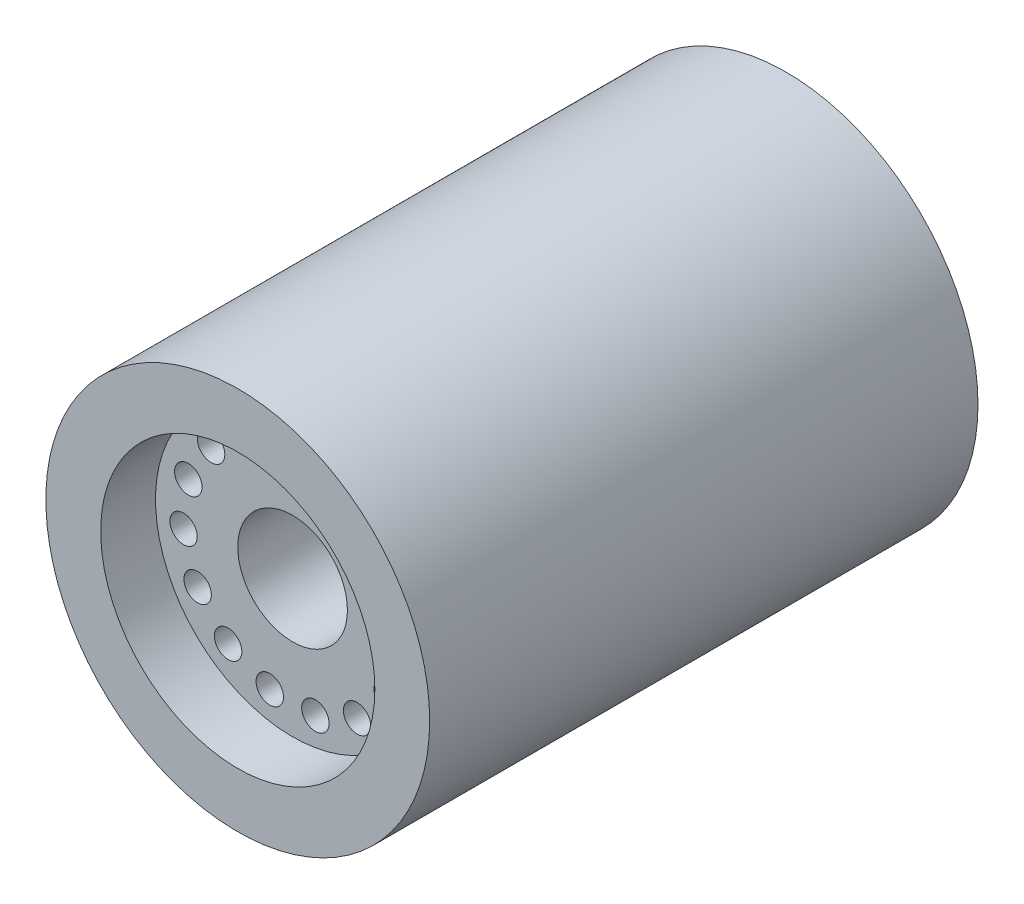
ISO-10303-21;
HEADER;
FILE_DESCRIPTION(('STEP AP214'),'2;1');
FILE_NAME('part.step','',(''),(''),'','','');
FILE_SCHEMA(('AUTOMOTIVE_DESIGN { 1 0 10303 214 1 1 1 1 }'));
ENDSEC;
DATA;
#1=APPLICATION_CONTEXT('core data for automotive mechanical design processes');
#2=APPLICATION_PROTOCOL_DEFINITION('international standard','automotive_design',2000,#1);
#3=PRODUCT_CONTEXT('',#1,'mechanical');
#4=PRODUCT('Part','Part','',(#3));
#5=PRODUCT_RELATED_PRODUCT_CATEGORY('part','',(#4));
#6=PRODUCT_DEFINITION_FORMATION('','',#4);
#7=PRODUCT_DEFINITION_CONTEXT('part definition',#1,'design');
#8=PRODUCT_DEFINITION('design','',#6,#7);
#9=PRODUCT_DEFINITION_SHAPE('','',#8);
#10=(LENGTH_UNIT() NAMED_UNIT(*) SI_UNIT(.MILLI.,.METRE.));
#11=(NAMED_UNIT(*) PLANE_ANGLE_UNIT() SI_UNIT($,.RADIAN.));
#12=(NAMED_UNIT(*) SI_UNIT($,.STERADIAN.) SOLID_ANGLE_UNIT());
#13=UNCERTAINTY_MEASURE_WITH_UNIT(LENGTH_MEASURE(1.E-05),#10,'distance_accuracy_value','');
#14=(GEOMETRIC_REPRESENTATION_CONTEXT(3) GLOBAL_UNCERTAINTY_ASSIGNED_CONTEXT((#13)) GLOBAL_UNIT_ASSIGNED_CONTEXT((#10,
#11,#12)) REPRESENTATION_CONTEXT('',''));
#15=CARTESIAN_POINT('',(0.,0.,0.));
#16=DIRECTION('',(0.,0.,1.));
#17=DIRECTION('',(1.,0.,0.));
#18=AXIS2_PLACEMENT_3D('',#15,#16,#17);
#19=CARTESIAN_POINT('',(0.,0.,100.));
#20=DIRECTION('',(0.,0.,-1.));
#21=DIRECTION('',(-1.,0.,0.));
#22=AXIS2_PLACEMENT_3D('',#19,#20,#21);
#23=CYLINDRICAL_SURFACE('',#22,35.);
#24=CARTESIAN_POINT('',(3.50056930846173,-34.8245030763779,51.6958779282518));
#25=CARTESIAN_POINT('',(3.50056306462018,-34.8245044881549,51.5526963878723));
#26=CARTESIAN_POINT('',(3.48851084502206,-34.82572172866,51.4094158838271));
#27=CARTESIAN_POINT('',(3.44060526173561,-34.8304865382661,51.1268149493158));
#28=CARTESIAN_POINT('',(3.40472453630342,-34.8340367862584,50.9874992635718));
#29=CARTESIAN_POINT('',(3.31019542398208,-34.843146350984,50.7169621478842));
#30=CARTESIAN_POINT('',(3.25155946878842,-34.8487045706025,50.5857363435418));
#31=CARTESIAN_POINT('',(3.11319636067268,-34.8613369101221,50.3350441869105));
#32=CARTESIAN_POINT('',(3.03347388792651,-34.8684106935759,50.2155752332388));
#33=CARTESIAN_POINT('',(2.85501640070205,-34.8834758906714,49.9915164914884));
#34=CARTESIAN_POINT('',(2.75624802699985,-34.8914689042977,49.8869533785149));
#35=CARTESIAN_POINT('',(2.54255998188531,-34.9076903578431,49.6959032479033));
#36=CARTESIAN_POINT('',(2.42763962242006,-34.9159188077795,49.6094170007059));
#37=CARTESIAN_POINT('',(2.18474307928868,-34.9319582235311,49.4568899465369));
#38=CARTESIAN_POINT('',(2.05675265826866,-34.9397687196469,49.3908717583765));
#39=CARTESIAN_POINT('',(1.79143847479645,-34.9543757061059,49.2812995649395));
#40=CARTESIAN_POINT('',(1.65411484175529,-34.9611722105046,49.2377452482587));
#41=CARTESIAN_POINT('',(1.37428680416693,-34.9732884192269,49.1744126639521));
#42=CARTESIAN_POINT('',(1.23179214232253,-34.9786107527021,49.1545918554968));
#43=CARTESIAN_POINT('',(0.945445229572748,-34.9875213215138,49.1391574896014));
#44=CARTESIAN_POINT('',(0.801592998631433,-34.9911095823108,49.143543576733));
#45=CARTESIAN_POINT('',(0.516903366842243,-34.9964719402864,49.1763635529131));
#46=CARTESIAN_POINT('',(0.376060752455348,-34.9982494748281,49.2047516897831));
#47=CARTESIAN_POINT('',(0.101101743042028,-35.000124191676,49.2846988644212));
#48=CARTESIAN_POINT('',(-0.0330146008164454,-35.0002213612011,49.3362580784262));
#49=CARTESIAN_POINT('',(-0.290852266639738,-34.9990294226744,49.4611352600484));
#50=CARTESIAN_POINT('',(-0.414563594066219,-34.9977389978019,49.5344738483442));
#51=CARTESIAN_POINT('',(-0.64795946053717,-34.9941965717247,49.7008129818558));
#52=CARTESIAN_POINT('',(-0.757643782712622,-34.9919445556555,49.7938138310074));
#53=CARTESIAN_POINT('',(-0.960127693048924,-34.9869755655215,49.9970956834442));
#54=CARTESIAN_POINT('',(-1.05288737128987,-34.9842575210355,50.1074164184717));
#55=CARTESIAN_POINT('',(-1.21856855023095,-34.9788791154567,50.3420675879929));
#56=CARTESIAN_POINT('',(-1.29149003957987,-34.976218754397,50.4663980305026));
#57=CARTESIAN_POINT('',(-1.4154119695259,-34.9714236756126,50.725565946093));
#58=CARTESIAN_POINT('',(-1.46641054518352,-34.9692890026139,50.8604043119101));
#59=CARTESIAN_POINT('',(-1.54500234675957,-34.9659052305147,51.1367480690707));
#60=CARTESIAN_POINT('',(-1.57259594844772,-34.9646561171965,51.2782533533377));
#61=CARTESIAN_POINT('',(-1.60353971750706,-34.9632507741844,51.5635653693177));
#62=CARTESIAN_POINT('',(-1.60694555337319,-34.9630920350061,51.7073660524579));
#63=CARTESIAN_POINT('',(-1.5895621581875,-34.9638865818685,51.9934933931417));
#64=CARTESIAN_POINT('',(-1.56877309933111,-34.9648398599948,52.1358200611686));
#65=CARTESIAN_POINT('',(-1.50363984676803,-34.9677010541995,52.4148009627691));
#66=CARTESIAN_POINT('',(-1.45932144669462,-34.969607924786,52.5514612315159));
#67=CARTESIAN_POINT('',(-1.34842083637598,-34.9740592888922,52.8154166464546));
#68=CARTESIAN_POINT('',(-1.28183835154435,-34.9766037902758,52.94271167712));
#69=CARTESIAN_POINT('',(-1.1281679811034,-34.9818972615236,53.184578034519));
#70=CARTESIAN_POINT('',(-1.04104292530347,-34.984646595775,53.2991257363102));
#71=CARTESIAN_POINT('',(-0.848826274779298,-34.9898372852913,53.5120074944943));
#72=CARTESIAN_POINT('',(-0.743734442371767,-34.9922786364811,53.6103413363595));
#73=CARTESIAN_POINT('',(-0.518339649250032,-34.9963430740558,53.788192698121));
#74=CARTESIAN_POINT('',(-0.398008222511478,-34.9979646000384,53.8676741842305));
#75=CARTESIAN_POINT('',(-0.145704154763008,-34.9999237742411,54.005317768878));
#76=CARTESIAN_POINT('',(-0.0137316064712359,-35.000261432686,54.0634800371983));
#77=CARTESIAN_POINT('',(0.257968535815343,-34.9993124829475,54.1567718605049));
#78=CARTESIAN_POINT('',(0.397688387277609,-34.9980274694305,54.1919239769948));
#79=CARTESIAN_POINT('',(0.681018874391691,-34.9936605416811,54.2382714475943));
#80=CARTESIAN_POINT('',(0.824629455300903,-34.9905786527181,54.2494671385939));
#81=CARTESIAN_POINT('',(1.11130713214207,-34.9826458666226,54.247580409434));
#82=CARTESIAN_POINT('',(1.25437471591377,-34.9777990912764,54.2345542691687));
#83=CARTESIAN_POINT('',(1.53624017731425,-34.9665535650932,54.1847106485431));
#84=CARTESIAN_POINT('',(1.67503804813819,-34.9601548117829,54.1478931302674));
#85=CARTESIAN_POINT('',(1.94443617813893,-34.9462068895991,54.0515253799042));
#86=CARTESIAN_POINT('',(2.07503666247591,-34.938657752343,53.9919757725244));
#87=CARTESIAN_POINT('',(2.32437152910733,-34.9229569410869,53.8518412280274));
#88=CARTESIAN_POINT('',(2.44310616292192,-34.9148052798649,53.7712567369169));
#89=CARTESIAN_POINT('',(2.66563675479953,-34.8985225735175,53.5911296729869));
#90=CARTESIAN_POINT('',(2.76939930051206,-34.8903916131014,53.4915458154003));
#91=CARTESIAN_POINT('',(2.958784308553,-34.8748426555203,53.2763139268168));
#92=CARTESIAN_POINT('',(3.04440234755925,-34.8674248324462,53.1606619900457));
#93=CARTESIAN_POINT('',(3.19516705498617,-34.8539332563265,52.916402277426));
#94=CARTESIAN_POINT('',(3.26028217522831,-34.8478615788231,52.7877749337311));
#95=CARTESIAN_POINT('',(3.36795110755158,-34.8376212971254,52.5214487973694));
#96=CARTESIAN_POINT('',(3.41053111849035,-34.8334504838123,52.3837607489009));
#97=CARTESIAN_POINT('',(3.46096441622642,-34.8284666713708,52.1536830073081));
#98=CARTESIAN_POINT('',(3.47579689178132,-34.8269857512413,52.0627772121787));
#99=CARTESIAN_POINT('',(3.4956013346955,-34.8250035010238,51.8798872128024));
#100=CARTESIAN_POINT('',(3.50057332147928,-34.8245021690061,51.7879030106803));
#101=CARTESIAN_POINT('',(3.50056930846173,-34.8245030763779,51.6958779282518));
#102=B_SPLINE_CURVE_WITH_KNOTS('',3,(#24,#25,#26,#27,#28,#29,#30,#31,#32,#33,#34,#35,#36,#37,
#38,#39,#40,#41,#42,#43,#44,#45,#46,#47,#48,#49,#50,#51,#52,#53,#54,#55,#56,#57,#58,#59,#60,#61,
#62,#63,#64,#65,#66,#67,#68,#69,#70,#71,#72,#73,#74,#75,#76,#77,#78,#79,#80,#81,#82,#83,#84,#85,
#86,#87,#88,#89,#90,#91,#92,#93,#94,#95,#96,#97,#98,#99,#100,#101),.UNSPECIFIED.,.T.,.F.,(4,2,2,
2,2,2,2,2,2,2,2,2,2,2,2,2,2,2,2,2,2,2,2,2,2,2,2,2,2,2,2,2,2,2,2,2,2,2,4),(0.,0.429208648665112,
0.858911002230849,1.28837892943957,1.71775161563763,2.147883300901,2.57803331475278,
3.00865699761921,3.439274710827,3.86911940772799,4.29895779326428,4.72797867277193,
5.15700281542375,5.58643445960809,6.01587274235578,6.44631095037071,6.8767494046774,
7.30722446830058,7.73769262046307,8.16716972189291,8.5966437667464,9.02564797728281,
9.45465747898978,9.88444927929393,10.3142467657729,10.7448592501568,11.1754683051473,
11.6056545120739,12.035834669416,12.4650165435764,12.8941991017084,13.3233698661851,
13.752531531609,14.182636591804,14.6128463839891,15.0437149482277,15.4740814869573,
15.7499413427485,16.0258006551136),.UNSPECIFIED.);
#103=CARTESIAN_POINT('',(3.50056930846173,-34.8245030763779,51.6958779282518));
#104=VERTEX_POINT('',#103);
#105=EDGE_CURVE('E11',#104,#104,#102,.T.);
#106=ORIENTED_EDGE('',*,*,#105,.T.);
#107=EDGE_LOOP('',(#106));
#108=FACE_BOUND('',#107,.T.);
#109=CARTESIAN_POINT('',(0.,0.,100.));
#110=DIRECTION('',(0.,0.,1.));
#111=DIRECTION('',(1.,0.,0.));
#112=AXIS2_PLACEMENT_3D('',#109,#110,#111);
#113=CIRCLE('',#112,35.);
#114=CARTESIAN_POINT('',(35.,0.,100.));
#115=VERTEX_POINT('',#114);
#116=EDGE_CURVE('E47',#115,#115,#113,.T.);
#117=ORIENTED_EDGE('',*,*,#116,.F.);
#118=EDGE_LOOP('',(#117));
#119=FACE_BOUND('',#118,.T.);
#120=CARTESIAN_POINT('',(0.,0.,0.));
#121=DIRECTION('',(0.,0.,1.));
#122=DIRECTION('',(1.,0.,0.));
#123=AXIS2_PLACEMENT_3D('',#120,#121,#122);
#124=CIRCLE('',#123,35.);
#125=CARTESIAN_POINT('',(35.,0.,0.));
#126=VERTEX_POINT('',#125);
#127=EDGE_CURVE('E159',#126,#126,#124,.T.);
#128=ORIENTED_EDGE('',*,*,#127,.T.);
#129=EDGE_LOOP('',(#128));
#130=FACE_BOUND('',#129,.T.);
#131=ADVANCED_FACE('F37',(#108,#119,#130),#23,.T.);
#132=CARTESIAN_POINT('',(0.,0.,100.));
#133=DIRECTION('',(0.,0.,1.));
#134=DIRECTION('',(1.,0.,0.));
#135=AXIS2_PLACEMENT_3D('',#132,#133,#134);
#136=PLANE('',#135);
#137=CARTESIAN_POINT('',(0.,0.,100.));
#138=DIRECTION('',(0.,0.,1.));
#139=DIRECTION('',(1.,0.,0.));
#140=AXIS2_PLACEMENT_3D('',#137,#138,#139);
#141=CIRCLE('',#140,25.);
#142=CARTESIAN_POINT('',(25.,0.,100.));
#143=VERTEX_POINT('',#142);
#144=EDGE_CURVE('E69',#143,#143,#141,.T.);
#145=ORIENTED_EDGE('',*,*,#144,.F.);
#146=EDGE_LOOP('',(#145));
#147=FACE_BOUND('',#146,.T.);
#148=ORIENTED_EDGE('',*,*,#116,.T.);
#149=EDGE_LOOP('',(#148));
#150=FACE_BOUND('',#149,.T.);
#151=ADVANCED_FACE('F181',(#147,#150),#136,.T.);
#152=CARTESIAN_POINT('',(0.,0.,0.));
#153=DIRECTION('',(0.,0.,1.));
#154=DIRECTION('',(1.,0.,0.));
#155=AXIS2_PLACEMENT_3D('',#152,#153,#154);
#156=PLANE('',#155);
#157=CARTESIAN_POINT('',(0.,0.,0.));
#158=DIRECTION('',(0.,0.,1.));
#159=DIRECTION('',(1.,0.,0.));
#160=AXIS2_PLACEMENT_3D('',#157,#158,#159);
#161=CIRCLE('',#160,10.);
#162=CARTESIAN_POINT('',(10.,0.,0.));
#163=VERTEX_POINT('',#162);
#164=EDGE_CURVE('E59',#163,#163,#161,.T.);
#165=ORIENTED_EDGE('',*,*,#164,.T.);
#166=EDGE_LOOP('',(#165));
#167=FACE_BOUND('',#166,.T.);
#168=ORIENTED_EDGE('',*,*,#127,.F.);
#169=EDGE_LOOP('',(#168));
#170=FACE_BOUND('',#169,.T.);
#171=ADVANCED_FACE('F178',(#167,#170),#156,.F.);
#172=CARTESIAN_POINT('',(0.,0.,90.));
#173=DIRECTION('',(0.,0.,1.));
#174=DIRECTION('',(1.,0.,0.));
#175=AXIS2_PLACEMENT_3D('',#172,#173,#174);
#176=PLANE('',#175);
#177=CARTESIAN_POINT('',(0.,0.,90.));
#178=DIRECTION('',(0.,0.,1.));
#179=DIRECTION('',(1.,0.,0.));
#180=AXIS2_PLACEMENT_3D('',#177,#178,#179);
#181=CIRCLE('',#180,10.);
#182=CARTESIAN_POINT('',(10.,0.,90.));
#183=VERTEX_POINT('',#182);
#184=EDGE_CURVE('E62',#183,#183,#181,.F.);
#185=ORIENTED_EDGE('',*,*,#184,.T.);
#186=EDGE_LOOP('',(#185));
#187=FACE_BOUND('',#186,.T.);
#188=CARTESIAN_POINT('',(0.,0.,90.));
#189=DIRECTION('',(0.,0.,1.));
#190=DIRECTION('',(1.,0.,0.));
#191=AXIS2_PLACEMENT_3D('',#188,#189,#190);
#192=CIRCLE('',#191,25.);
#193=CARTESIAN_POINT('',(25.,0.,90.));
#194=VERTEX_POINT('',#193);
#195=EDGE_CURVE('E65',#194,#194,#192,.T.);
#196=ORIENTED_EDGE('',*,*,#195,.T.);
#197=EDGE_LOOP('',(#196));
#198=FACE_BOUND('',#197,.T.);
#199=CARTESIAN_POINT('',(4.15823381635507,-19.5629520146761,90.));
#200=DIRECTION('',(0.,0.,1.));
#201=DIRECTION('',(1.,0.,0.));
#202=AXIS2_PLACEMENT_3D('',#199,#200,#201);
#203=CIRCLE('',#202,2.5);
#204=CARTESIAN_POINT('',(6.65823381635506,-19.5629520146761,90.));
#205=VERTEX_POINT('',#204);
#206=EDGE_CURVE('E68',#205,#205,#203,.F.);
#207=ORIENTED_EDGE('',*,*,#206,.T.);
#208=EDGE_LOOP('',(#207));
#209=FACE_BOUND('',#208,.T.);
#210=CARTESIAN_POINT('',(-4.15823381635533,-19.5629520146761,90.));
#211=DIRECTION('',(0.,0.,1.));
#212=DIRECTION('',(1.,0.,0.));
#213=AXIS2_PLACEMENT_3D('',#210,#211,#212);
#214=CIRCLE('',#213,2.5);
#215=CARTESIAN_POINT('',(-1.65823381635533,-19.5629520146761,90.));
#216=VERTEX_POINT('',#215);
#217=EDGE_CURVE('E72',#216,#216,#214,.F.);
#218=ORIENTED_EDGE('',*,*,#217,.T.);
#219=EDGE_LOOP('',(#218));
#220=FACE_BOUND('',#219,.T.);
#221=CARTESIAN_POINT('',(-19.8904379073655,-2.09056926535287,90.));
#222=DIRECTION('',(0.,0.,1.));
#223=DIRECTION('',(1.,0.,0.));
#224=AXIS2_PLACEMENT_3D('',#221,#222,#223);
#225=CIRCLE('',#224,2.5);
#226=CARTESIAN_POINT('',(-17.3904379073655,-2.09056926535287,90.));
#227=VERTEX_POINT('',#226);
#228=EDGE_CURVE('E75',#227,#227,#225,.F.);
#229=ORIENTED_EDGE('',*,*,#228,.T.);
#230=EDGE_LOOP('',(#229));
#231=FACE_BOUND('',#230,.T.);
#232=CARTESIAN_POINT('',(-11.7557050458496,-16.1803398874988,90.));
#233=DIRECTION('',(0.,0.,1.));
#234=DIRECTION('',(1.,0.,0.));
#235=AXIS2_PLACEMENT_3D('',#232,#233,#234);
#236=CIRCLE('',#235,2.5);
#237=CARTESIAN_POINT('',(-9.2557050458496,-16.1803398874988,90.));
#238=VERTEX_POINT('',#237);
#239=EDGE_CURVE('E78',#238,#238,#236,.F.);
#240=ORIENTED_EDGE('',*,*,#239,.T.);
#241=EDGE_LOOP('',(#240));
#242=FACE_BOUND('',#241,.T.);
#243=CARTESIAN_POINT('',(-17.3205080756889,-9.99999999999984,90.));
#244=DIRECTION('',(0.,0.,1.));
#245=DIRECTION('',(1.,0.,0.));
#246=AXIS2_PLACEMENT_3D('',#243,#244,#245);
#247=CIRCLE('',#246,2.5);
#248=CARTESIAN_POINT('',(-14.8205080756889,-9.99999999999984,90.));
#249=VERTEX_POINT('',#248);
#250=EDGE_CURVE('E81',#249,#249,#247,.F.);
#251=ORIENTED_EDGE('',*,*,#250,.T.);
#252=EDGE_LOOP('',(#251));
#253=FACE_BOUND('',#252,.T.);
#254=CARTESIAN_POINT('',(-19.021130325903,6.18033988749915,90.));
#255=DIRECTION('',(0.,0.,1.));
#256=DIRECTION('',(1.,0.,0.));
#257=AXIS2_PLACEMENT_3D('',#254,#255,#256);
#258=CIRCLE('',#257,2.5);
#259=CARTESIAN_POINT('',(-16.521130325903,6.18033988749915,90.));
#260=VERTEX_POINT('',#259);
#261=EDGE_CURVE('E84',#260,#260,#258,.F.);
#262=ORIENTED_EDGE('',*,*,#261,.T.);
#263=EDGE_LOOP('',(#262));
#264=FACE_BOUND('',#263,.T.);
#265=CARTESIAN_POINT('',(-14.8628965095477,13.3826121271773,90.));
#266=DIRECTION('',(0.,0.,1.));
#267=DIRECTION('',(1.,0.,0.));
#268=AXIS2_PLACEMENT_3D('',#265,#266,#267);
#269=CIRCLE('',#268,2.5);
#270=CARTESIAN_POINT('',(-12.3628965095477,13.3826121271773,90.));
#271=VERTEX_POINT('',#270);
#272=EDGE_CURVE('E87',#271,#271,#269,.F.);
#273=ORIENTED_EDGE('',*,*,#272,.T.);
#274=EDGE_LOOP('',(#273));
#275=FACE_BOUND('',#274,.T.);
#276=CARTESIAN_POINT('',(-8.13473286151578,18.2709091528521,90.));
#277=DIRECTION('',(0.,0.,1.));
#278=DIRECTION('',(1.,0.,0.));
#279=AXIS2_PLACEMENT_3D('',#276,#277,#278);
#280=CIRCLE('',#279,2.5);
#281=CARTESIAN_POINT('',(-5.63473286151578,18.2709091528521,90.));
#282=VERTEX_POINT('',#281);
#283=EDGE_CURVE('E90',#282,#282,#280,.F.);
#284=ORIENTED_EDGE('',*,*,#283,.T.);
#285=EDGE_LOOP('',(#284));
#286=FACE_BOUND('',#285,.T.);
#287=CARTESIAN_POINT('',(17.3205080756887,-10.0000000000001,90.));
#288=DIRECTION('',(0.,0.,1.));
#289=DIRECTION('',(1.,0.,0.));
#290=AXIS2_PLACEMENT_3D('',#287,#288,#289);
#291=CIRCLE('',#290,2.5);
#292=CARTESIAN_POINT('',(19.8205080756887,-10.0000000000001,90.));
#293=VERTEX_POINT('',#292);
#294=EDGE_CURVE('E93',#293,#293,#291,.F.);
#295=ORIENTED_EDGE('',*,*,#294,.T.);
#296=EDGE_LOOP('',(#295));
#297=FACE_BOUND('',#296,.T.);
#298=CARTESIAN_POINT('',(19.0211303259031,6.1803398874989,90.));
#299=DIRECTION('',(0.,0.,1.));
#300=DIRECTION('',(1.,0.,0.));
#301=AXIS2_PLACEMENT_3D('',#298,#299,#300);
#302=CIRCLE('',#301,2.5);
#303=CARTESIAN_POINT('',(21.5211303259031,6.1803398874989,90.));
#304=VERTEX_POINT('',#303);
#305=EDGE_CURVE('E96',#304,#304,#302,.F.);
#306=ORIENTED_EDGE('',*,*,#305,.T.);
#307=EDGE_LOOP('',(#306));
#308=FACE_BOUND('',#307,.T.);
#309=CARTESIAN_POINT('',(11.7557050458494,-16.180339887499,90.));
#310=DIRECTION('',(0.,0.,1.));
#311=DIRECTION('',(1.,0.,0.));
#312=AXIS2_PLACEMENT_3D('',#309,#310,#311);
#313=CIRCLE('',#312,2.5);
#314=CARTESIAN_POINT('',(14.2557050458494,-16.180339887499,90.));
#315=VERTEX_POINT('',#314);
#316=EDGE_CURVE('E99',#315,#315,#313,.F.);
#317=ORIENTED_EDGE('',*,*,#316,.T.);
#318=EDGE_LOOP('',(#317));
#319=FACE_BOUND('',#318,.T.);
#320=CARTESIAN_POINT('',(19.8904379073655,-2.09056926535314,90.));
#321=DIRECTION('',(0.,0.,1.));
#322=DIRECTION('',(1.,0.,0.));
#323=AXIS2_PLACEMENT_3D('',#320,#321,#322);
#324=CIRCLE('',#323,2.5);
#325=CARTESIAN_POINT('',(22.3904379073655,-2.09056926535314,90.));
#326=VERTEX_POINT('',#325);
#327=EDGE_CURVE('E102',#326,#326,#324,.F.);
#328=ORIENTED_EDGE('',*,*,#327,.T.);
#329=EDGE_LOOP('',(#328));
#330=FACE_BOUND('',#329,.T.);
#331=CARTESIAN_POINT('',(14.8628965095479,13.3826121271771,90.));
#332=DIRECTION('',(0.,0.,1.));
#333=DIRECTION('',(1.,0.,0.));
#334=AXIS2_PLACEMENT_3D('',#331,#332,#333);
#335=CIRCLE('',#334,2.5);
#336=CARTESIAN_POINT('',(17.3628965095479,13.3826121271771,90.));
#337=VERTEX_POINT('',#336);
#338=EDGE_CURVE('E105',#337,#337,#335,.F.);
#339=ORIENTED_EDGE('',*,*,#338,.T.);
#340=EDGE_LOOP('',(#339));
#341=FACE_BOUND('',#340,.T.);
#342=CARTESIAN_POINT('',(8.13473286151602,18.270909152852,90.));
#343=DIRECTION('',(0.,0.,1.));
#344=DIRECTION('',(1.,0.,0.));
#345=AXIS2_PLACEMENT_3D('',#342,#343,#344);
#346=CIRCLE('',#345,2.5);
#347=CARTESIAN_POINT('',(10.634732861516,18.270909152852,90.));
#348=VERTEX_POINT('',#347);
#349=EDGE_CURVE('E108',#348,#348,#346,.F.);
#350=ORIENTED_EDGE('',*,*,#349,.T.);
#351=EDGE_LOOP('',(#350));
#352=FACE_BOUND('',#351,.T.);
#353=CARTESIAN_POINT('',(0.,20.,90.));
#354=DIRECTION('',(0.,0.,1.));
#355=DIRECTION('',(1.,0.,0.));
#356=AXIS2_PLACEMENT_3D('',#353,#354,#355);
#357=CIRCLE('',#356,2.5);
#358=CARTESIAN_POINT('',(2.5,20.,90.));
#359=VERTEX_POINT('',#358);
#360=EDGE_CURVE('E111',#359,#359,#357,.F.);
#361=ORIENTED_EDGE('',*,*,#360,.T.);
#362=EDGE_LOOP('',(#361));
#363=FACE_BOUND('',#362,.T.);
#364=ADVANCED_FACE('F168',(#187,#198,#209,#220,#231,#242,#253,#264,#275,#286,#297,#308,#319,
#330,#341,#352,#363),#176,.T.);
#365=CARTESIAN_POINT('',(0.,0.,90.));
#366=DIRECTION('',(0.,0.,1.));
#367=DIRECTION('',(1.,0.,0.));
#368=AXIS2_PLACEMENT_3D('',#365,#366,#367);
#369=CYLINDRICAL_SURFACE('',#368,25.);
#370=ORIENTED_EDGE('',*,*,#195,.F.);
#371=EDGE_LOOP('',(#370));
#372=FACE_BOUND('',#371,.T.);
#373=ORIENTED_EDGE('',*,*,#144,.T.);
#374=EDGE_LOOP('',(#373));
#375=FACE_BOUND('',#374,.T.);
#376=ADVANCED_FACE('F203',(#372,#375),#369,.F.);
#377=CARTESIAN_POINT('',(-4.15823381635533,-19.5629520146761,85.));
#378=DIRECTION('',(0.,0.,1.));
#379=DIRECTION('',(1.,0.,0.));
#380=AXIS2_PLACEMENT_3D('',#377,#378,#379);
#381=PLANE('',#380);
#382=CARTESIAN_POINT('',(-4.15823381635533,-19.5629520146761,85.));
#383=DIRECTION('',(0.,0.,1.));
#384=DIRECTION('',(1.,0.,0.));
#385=AXIS2_PLACEMENT_3D('',#382,#383,#384);
#386=CIRCLE('',#385,2.5);
#387=CARTESIAN_POINT('',(-1.65823381635533,-19.5629520146761,85.));
#388=VERTEX_POINT('',#387);
#389=EDGE_CURVE('E140',#388,#388,#386,.T.);
#390=ORIENTED_EDGE('',*,*,#389,.T.);
#391=EDGE_LOOP('',(#390));
#392=FACE_BOUND('',#391,.T.);
#393=ADVANCED_FACE('F206',(#392),#381,.T.);
#394=CARTESIAN_POINT('',(-4.15823381635533,-19.5629520146761,85.));
#395=DIRECTION('',(0.,0.,1.));
#396=DIRECTION('',(1.,0.,0.));
#397=AXIS2_PLACEMENT_3D('',#394,#395,#396);
#398=CYLINDRICAL_SURFACE('',#397,2.5);
#399=ORIENTED_EDGE('',*,*,#389,.F.);
#400=EDGE_LOOP('',(#399));
#401=FACE_BOUND('',#400,.T.);
#402=ORIENTED_EDGE('',*,*,#217,.F.);
#403=EDGE_LOOP('',(#402));
#404=FACE_BOUND('',#403,.T.);
#405=ADVANCED_FACE('F274',(#401,#404),#398,.F.);
#406=CARTESIAN_POINT('',(-19.8904379073655,-2.09056926535287,85.));
#407=DIRECTION('',(0.,0.,1.));
#408=DIRECTION('',(1.,0.,0.));
#409=AXIS2_PLACEMENT_3D('',#406,#407,#408);
#410=PLANE('',#409);
#411=CARTESIAN_POINT('',(-19.8904379073655,-2.09056926535287,85.));
#412=DIRECTION('',(0.,0.,1.));
#413=DIRECTION('',(1.,0.,0.));
#414=AXIS2_PLACEMENT_3D('',#411,#412,#413);
#415=CIRCLE('',#414,2.5);
#416=CARTESIAN_POINT('',(-17.3904379073655,-2.09056926535287,85.));
#417=VERTEX_POINT('',#416);
#418=EDGE_CURVE('E137',#417,#417,#415,.T.);
#419=ORIENTED_EDGE('',*,*,#418,.T.);
#420=EDGE_LOOP('',(#419));
#421=FACE_BOUND('',#420,.T.);
#422=ADVANCED_FACE('F270',(#421),#410,.T.);
#423=CARTESIAN_POINT('',(-19.8904379073655,-2.09056926535287,85.));
#424=DIRECTION('',(0.,0.,1.));
#425=DIRECTION('',(1.,0.,0.));
#426=AXIS2_PLACEMENT_3D('',#423,#424,#425);
#427=CYLINDRICAL_SURFACE('',#426,2.5);
#428=ORIENTED_EDGE('',*,*,#418,.F.);
#429=EDGE_LOOP('',(#428));
#430=FACE_BOUND('',#429,.T.);
#431=ORIENTED_EDGE('',*,*,#228,.F.);
#432=EDGE_LOOP('',(#431));
#433=FACE_BOUND('',#432,.T.);
#434=ADVANCED_FACE('F266',(#430,#433),#427,.F.);
#435=CARTESIAN_POINT('',(-11.7557050458496,-16.1803398874988,85.));
#436=DIRECTION('',(0.,0.,1.));
#437=DIRECTION('',(1.,0.,0.));
#438=AXIS2_PLACEMENT_3D('',#435,#436,#437);
#439=PLANE('',#438);
#440=CARTESIAN_POINT('',(-11.7557050458496,-16.1803398874988,85.));
#441=DIRECTION('',(0.,0.,1.));
#442=DIRECTION('',(1.,0.,0.));
#443=AXIS2_PLACEMENT_3D('',#440,#441,#442);
#444=CIRCLE('',#443,2.5);
#445=CARTESIAN_POINT('',(-9.2557050458496,-16.1803398874988,85.));
#446=VERTEX_POINT('',#445);
#447=EDGE_CURVE('E133',#446,#446,#444,.T.);
#448=ORIENTED_EDGE('',*,*,#447,.T.);
#449=EDGE_LOOP('',(#448));
#450=FACE_BOUND('',#449,.T.);
#451=ADVANCED_FACE('F262',(#450),#439,.T.);
#452=CARTESIAN_POINT('',(-11.7557050458496,-16.1803398874988,85.));
#453=DIRECTION('',(0.,0.,1.));
#454=DIRECTION('',(1.,0.,0.));
#455=AXIS2_PLACEMENT_3D('',#452,#453,#454);
#456=CYLINDRICAL_SURFACE('',#455,2.5);
#457=ORIENTED_EDGE('',*,*,#447,.F.);
#458=EDGE_LOOP('',(#457));
#459=FACE_BOUND('',#458,.T.);
#460=ORIENTED_EDGE('',*,*,#239,.F.);
#461=EDGE_LOOP('',(#460));
#462=FACE_BOUND('',#461,.T.);
#463=ADVANCED_FACE('F258',(#459,#462),#456,.F.);
#464=CARTESIAN_POINT('',(-17.3205080756889,-9.99999999999984,85.));
#465=DIRECTION('',(0.,0.,1.));
#466=DIRECTION('',(1.,0.,0.));
#467=AXIS2_PLACEMENT_3D('',#464,#465,#466);
#468=PLANE('',#467);
#469=CARTESIAN_POINT('',(-17.3205080756889,-9.99999999999984,85.));
#470=DIRECTION('',(0.,0.,1.));
#471=DIRECTION('',(1.,0.,0.));
#472=AXIS2_PLACEMENT_3D('',#469,#470,#471);
#473=CIRCLE('',#472,2.5);
#474=CARTESIAN_POINT('',(-14.8205080756889,-9.99999999999984,85.));
#475=VERTEX_POINT('',#474);
#476=EDGE_CURVE('E136',#475,#475,#473,.T.);
#477=ORIENTED_EDGE('',*,*,#476,.T.);
#478=EDGE_LOOP('',(#477));
#479=FACE_BOUND('',#478,.T.);
#480=ADVANCED_FACE('F261',(#479),#468,.T.);
#481=CARTESIAN_POINT('',(-17.3205080756889,-9.99999999999984,85.));
#482=DIRECTION('',(0.,0.,1.));
#483=DIRECTION('',(1.,0.,0.));
#484=AXIS2_PLACEMENT_3D('',#481,#482,#483);
#485=CYLINDRICAL_SURFACE('',#484,2.5);
#486=ORIENTED_EDGE('',*,*,#476,.F.);
#487=EDGE_LOOP('',(#486));
#488=FACE_BOUND('',#487,.T.);
#489=ORIENTED_EDGE('',*,*,#250,.F.);
#490=EDGE_LOOP('',(#489));
#491=FACE_BOUND('',#490,.T.);
#492=ADVANCED_FACE('F312',(#488,#491),#485,.F.);
#493=CARTESIAN_POINT('',(-19.021130325903,6.18033988749915,85.));
#494=DIRECTION('',(0.,0.,1.));
#495=DIRECTION('',(1.,0.,0.));
#496=AXIS2_PLACEMENT_3D('',#493,#494,#495);
#497=PLANE('',#496);
#498=CARTESIAN_POINT('',(-19.021130325903,6.18033988749915,85.));
#499=DIRECTION('',(0.,0.,1.));
#500=DIRECTION('',(1.,0.,0.));
#501=AXIS2_PLACEMENT_3D('',#498,#499,#500);
#502=CIRCLE('',#501,2.5);
#503=CARTESIAN_POINT('',(-16.521130325903,6.18033988749915,85.));
#504=VERTEX_POINT('',#503);
#505=EDGE_CURVE('E152',#504,#504,#502,.T.);
#506=ORIENTED_EDGE('',*,*,#505,.T.);
#507=EDGE_LOOP('',(#506));
#508=FACE_BOUND('',#507,.T.);
#509=ADVANCED_FACE('F308',(#508),#497,.T.);
#510=CARTESIAN_POINT('',(-19.021130325903,6.18033988749915,85.));
#511=DIRECTION('',(0.,0.,1.));
#512=DIRECTION('',(1.,0.,0.));
#513=AXIS2_PLACEMENT_3D('',#510,#511,#512);
#514=CYLINDRICAL_SURFACE('',#513,2.5);
#515=ORIENTED_EDGE('',*,*,#505,.F.);
#516=EDGE_LOOP('',(#515));
#517=FACE_BOUND('',#516,.T.);
#518=ORIENTED_EDGE('',*,*,#261,.F.);
#519=EDGE_LOOP('',(#518));
#520=FACE_BOUND('',#519,.T.);
#521=ADVANCED_FACE('F304',(#517,#520),#514,.F.);
#522=CARTESIAN_POINT('',(-14.8628965095477,13.3826121271773,85.));
#523=DIRECTION('',(0.,0.,1.));
#524=DIRECTION('',(1.,0.,0.));
#525=AXIS2_PLACEMENT_3D('',#522,#523,#524);
#526=PLANE('',#525);
#527=CARTESIAN_POINT('',(-14.8628965095477,13.3826121271773,85.));
#528=DIRECTION('',(0.,0.,1.));
#529=DIRECTION('',(1.,0.,0.));
#530=AXIS2_PLACEMENT_3D('',#527,#528,#529);
#531=CIRCLE('',#530,2.5);
#532=CARTESIAN_POINT('',(-12.3628965095477,13.3826121271773,85.));
#533=VERTEX_POINT('',#532);
#534=EDGE_CURVE('E149',#533,#533,#531,.T.);
#535=ORIENTED_EDGE('',*,*,#534,.T.);
#536=EDGE_LOOP('',(#535));
#537=FACE_BOUND('',#536,.T.);
#538=ADVANCED_FACE('F300',(#537),#526,.T.);
#539=CARTESIAN_POINT('',(-14.8628965095477,13.3826121271773,85.));
#540=DIRECTION('',(0.,0.,1.));
#541=DIRECTION('',(1.,0.,0.));
#542=AXIS2_PLACEMENT_3D('',#539,#540,#541);
#543=CYLINDRICAL_SURFACE('',#542,2.5);
#544=ORIENTED_EDGE('',*,*,#534,.F.);
#545=EDGE_LOOP('',(#544));
#546=FACE_BOUND('',#545,.T.);
#547=ORIENTED_EDGE('',*,*,#272,.F.);
#548=EDGE_LOOP('',(#547));
#549=FACE_BOUND('',#548,.T.);
#550=ADVANCED_FACE('F296',(#546,#549),#543,.F.);
#551=CARTESIAN_POINT('',(-8.13473286151578,18.2709091528521,85.));
#552=DIRECTION('',(0.,0.,1.));
#553=DIRECTION('',(1.,0.,0.));
#554=AXIS2_PLACEMENT_3D('',#551,#552,#553);
#555=PLANE('',#554);
#556=CARTESIAN_POINT('',(-8.13473286151578,18.2709091528521,85.));
#557=DIRECTION('',(0.,0.,1.));
#558=DIRECTION('',(1.,0.,0.));
#559=AXIS2_PLACEMENT_3D('',#556,#557,#558);
#560=CIRCLE('',#559,2.5);
#561=CARTESIAN_POINT('',(-5.63473286151578,18.2709091528521,85.));
#562=VERTEX_POINT('',#561);
#563=EDGE_CURVE('E145',#562,#562,#560,.T.);
#564=ORIENTED_EDGE('',*,*,#563,.T.);
#565=EDGE_LOOP('',(#564));
#566=FACE_BOUND('',#565,.T.);
#567=ADVANCED_FACE('F292',(#566),#555,.T.);
#568=CARTESIAN_POINT('',(-8.13473286151578,18.2709091528521,85.));
#569=DIRECTION('',(0.,0.,1.));
#570=DIRECTION('',(1.,0.,0.));
#571=AXIS2_PLACEMENT_3D('',#568,#569,#570);
#572=CYLINDRICAL_SURFACE('',#571,2.5);
#573=ORIENTED_EDGE('',*,*,#563,.F.);
#574=EDGE_LOOP('',(#573));
#575=FACE_BOUND('',#574,.T.);
#576=ORIENTED_EDGE('',*,*,#283,.F.);
#577=EDGE_LOOP('',(#576));
#578=FACE_BOUND('',#577,.T.);
#579=ADVANCED_FACE('F224',(#575,#578),#572,.F.);
#580=CARTESIAN_POINT('',(17.3205080756887,-10.0000000000001,85.));
#581=DIRECTION('',(0.,0.,1.));
#582=DIRECTION('',(1.,0.,0.));
#583=AXIS2_PLACEMENT_3D('',#580,#581,#582);
#584=PLANE('',#583);
#585=CARTESIAN_POINT('',(17.3205080756887,-10.0000000000001,85.));
#586=DIRECTION('',(0.,0.,1.));
#587=DIRECTION('',(1.,0.,0.));
#588=AXIS2_PLACEMENT_3D('',#585,#586,#587);
#589=CIRCLE('',#588,2.5);
#590=CARTESIAN_POINT('',(19.8205080756887,-10.0000000000001,85.));
#591=VERTEX_POINT('',#590);
#592=EDGE_CURVE('E119',#591,#591,#589,.T.);
#593=ORIENTED_EDGE('',*,*,#592,.T.);
#594=EDGE_LOOP('',(#593));
#595=FACE_BOUND('',#594,.T.);
#596=ADVANCED_FACE('F220',(#595),#584,.T.);
#597=CARTESIAN_POINT('',(17.3205080756887,-10.0000000000001,85.));
#598=DIRECTION('',(0.,0.,1.));
#599=DIRECTION('',(1.,0.,0.));
#600=AXIS2_PLACEMENT_3D('',#597,#598,#599);
#601=CYLINDRICAL_SURFACE('',#600,2.5);
#602=ORIENTED_EDGE('',*,*,#592,.F.);
#603=EDGE_LOOP('',(#602));
#604=FACE_BOUND('',#603,.T.);
#605=ORIENTED_EDGE('',*,*,#294,.F.);
#606=EDGE_LOOP('',(#605));
#607=FACE_BOUND('',#606,.T.);
#608=ADVANCED_FACE('F216',(#604,#607),#601,.F.);
#609=CARTESIAN_POINT('',(19.0211303259031,6.1803398874989,85.));
#610=DIRECTION('',(0.,0.,1.));
#611=DIRECTION('',(1.,0.,0.));
#612=AXIS2_PLACEMENT_3D('',#609,#610,#611);
#613=PLANE('',#612);
#614=CARTESIAN_POINT('',(19.0211303259031,6.1803398874989,85.));
#615=DIRECTION('',(0.,0.,1.));
#616=DIRECTION('',(1.,0.,0.));
#617=AXIS2_PLACEMENT_3D('',#614,#615,#616);
#618=CIRCLE('',#617,2.5);
#619=CARTESIAN_POINT('',(21.5211303259031,6.1803398874989,85.));
#620=VERTEX_POINT('',#619);
#621=EDGE_CURVE('E115',#620,#620,#618,.T.);
#622=ORIENTED_EDGE('',*,*,#621,.T.);
#623=EDGE_LOOP('',(#622));
#624=FACE_BOUND('',#623,.T.);
#625=ADVANCED_FACE('F212',(#624),#613,.T.);
#626=CARTESIAN_POINT('',(19.0211303259031,6.1803398874989,85.));
#627=DIRECTION('',(0.,0.,1.));
#628=DIRECTION('',(1.,0.,0.));
#629=AXIS2_PLACEMENT_3D('',#626,#627,#628);
#630=CYLINDRICAL_SURFACE('',#629,2.5);
#631=ORIENTED_EDGE('',*,*,#621,.F.);
#632=EDGE_LOOP('',(#631));
#633=FACE_BOUND('',#632,.T.);
#634=ORIENTED_EDGE('',*,*,#305,.F.);
#635=EDGE_LOOP('',(#634));
#636=FACE_BOUND('',#635,.T.);
#637=ADVANCED_FACE('F208',(#633,#636),#630,.F.);
#638=CARTESIAN_POINT('',(11.7557050458494,-16.180339887499,85.));
#639=DIRECTION('',(0.,0.,1.));
#640=DIRECTION('',(1.,0.,0.));
#641=AXIS2_PLACEMENT_3D('',#638,#639,#640);
#642=PLANE('',#641);
#643=CARTESIAN_POINT('',(11.7557050458494,-16.180339887499,85.));
#644=DIRECTION('',(0.,0.,1.));
#645=DIRECTION('',(1.,0.,0.));
#646=AXIS2_PLACEMENT_3D('',#643,#644,#645);
#647=CIRCLE('',#646,2.5);
#648=CARTESIAN_POINT('',(14.2557050458494,-16.180339887499,85.));
#649=VERTEX_POINT('',#648);
#650=EDGE_CURVE('E118',#649,#649,#647,.T.);
#651=ORIENTED_EDGE('',*,*,#650,.T.);
#652=EDGE_LOOP('',(#651));
#653=FACE_BOUND('',#652,.T.);
#654=ADVANCED_FACE('F211',(#653),#642,.T.);
#655=CARTESIAN_POINT('',(11.7557050458494,-16.180339887499,85.));
#656=DIRECTION('',(0.,0.,1.));
#657=DIRECTION('',(1.,0.,0.));
#658=AXIS2_PLACEMENT_3D('',#655,#656,#657);
#659=CYLINDRICAL_SURFACE('',#658,2.5);
#660=ORIENTED_EDGE('',*,*,#650,.F.);
#661=EDGE_LOOP('',(#660));
#662=FACE_BOUND('',#661,.T.);
#663=ORIENTED_EDGE('',*,*,#316,.F.);
#664=EDGE_LOOP('',(#663));
#665=FACE_BOUND('',#664,.T.);
#666=ADVANCED_FACE('F234',(#662,#665),#659,.F.);
#667=CARTESIAN_POINT('',(19.8904379073655,-2.09056926535314,85.));
#668=DIRECTION('',(0.,0.,1.));
#669=DIRECTION('',(1.,0.,0.));
#670=AXIS2_PLACEMENT_3D('',#667,#668,#669);
#671=PLANE('',#670);
#672=CARTESIAN_POINT('',(19.8904379073655,-2.09056926535314,85.));
#673=DIRECTION('',(0.,0.,1.));
#674=DIRECTION('',(1.,0.,0.));
#675=AXIS2_PLACEMENT_3D('',#672,#673,#674);
#676=CIRCLE('',#675,2.5);
#677=CARTESIAN_POINT('',(22.3904379073655,-2.09056926535314,85.));
#678=VERTEX_POINT('',#677);
#679=EDGE_CURVE('E123',#678,#678,#676,.T.);
#680=ORIENTED_EDGE('',*,*,#679,.T.);
#681=EDGE_LOOP('',(#680));
#682=FACE_BOUND('',#681,.T.);
#683=ADVANCED_FACE('F230',(#682),#671,.T.);
#684=CARTESIAN_POINT('',(19.8904379073655,-2.09056926535314,85.));
#685=DIRECTION('',(0.,0.,1.));
#686=DIRECTION('',(1.,0.,0.));
#687=AXIS2_PLACEMENT_3D('',#684,#685,#686);
#688=CYLINDRICAL_SURFACE('',#687,2.5);
#689=ORIENTED_EDGE('',*,*,#679,.F.);
#690=EDGE_LOOP('',(#689));
#691=FACE_BOUND('',#690,.T.);
#692=ORIENTED_EDGE('',*,*,#327,.F.);
#693=EDGE_LOOP('',(#692));
#694=FACE_BOUND('',#693,.T.);
#695=ADVANCED_FACE('F226',(#691,#694),#688,.F.);
#696=CARTESIAN_POINT('',(14.8628965095479,13.3826121271771,85.));
#697=DIRECTION('',(0.,0.,1.));
#698=DIRECTION('',(1.,0.,0.));
#699=AXIS2_PLACEMENT_3D('',#696,#697,#698);
#700=PLANE('',#699);
#701=CARTESIAN_POINT('',(14.8628965095479,13.3826121271771,85.));
#702=DIRECTION('',(0.,0.,1.));
#703=DIRECTION('',(1.,0.,0.));
#704=AXIS2_PLACEMENT_3D('',#701,#702,#703);
#705=CIRCLE('',#704,2.5);
#706=CARTESIAN_POINT('',(17.3628965095479,13.3826121271771,85.));
#707=VERTEX_POINT('',#706);
#708=EDGE_CURVE('E122',#707,#707,#705,.T.);
#709=ORIENTED_EDGE('',*,*,#708,.T.);
#710=EDGE_LOOP('',(#709));
#711=FACE_BOUND('',#710,.T.);
#712=ADVANCED_FACE('F229',(#711),#700,.T.);
#713=CARTESIAN_POINT('',(14.8628965095479,13.3826121271771,85.));
#714=DIRECTION('',(0.,0.,1.));
#715=DIRECTION('',(1.,0.,0.));
#716=AXIS2_PLACEMENT_3D('',#713,#714,#715);
#717=CYLINDRICAL_SURFACE('',#716,2.5);
#718=ORIENTED_EDGE('',*,*,#708,.F.);
#719=EDGE_LOOP('',(#718));
#720=FACE_BOUND('',#719,.T.);
#721=ORIENTED_EDGE('',*,*,#338,.F.);
#722=EDGE_LOOP('',(#721));
#723=FACE_BOUND('',#722,.T.);
#724=ADVANCED_FACE('F242',(#720,#723),#717,.F.);
#725=CARTESIAN_POINT('',(8.13473286151602,18.270909152852,85.));
#726=DIRECTION('',(0.,0.,1.));
#727=DIRECTION('',(1.,0.,0.));
#728=AXIS2_PLACEMENT_3D('',#725,#726,#727);
#729=PLANE('',#728);
#730=CARTESIAN_POINT('',(8.13473286151602,18.270909152852,85.));
#731=DIRECTION('',(0.,0.,1.));
#732=DIRECTION('',(1.,0.,0.));
#733=AXIS2_PLACEMENT_3D('',#730,#731,#732);
#734=CIRCLE('',#733,2.5);
#735=CARTESIAN_POINT('',(10.634732861516,18.270909152852,85.));
#736=VERTEX_POINT('',#735);
#737=EDGE_CURVE('E114',#736,#736,#734,.T.);
#738=ORIENTED_EDGE('',*,*,#737,.T.);
#739=EDGE_LOOP('',(#738));
#740=FACE_BOUND('',#739,.T.);
#741=ADVANCED_FACE('F245',(#740),#729,.T.);
#742=CARTESIAN_POINT('',(8.13473286151602,18.270909152852,85.));
#743=DIRECTION('',(0.,0.,1.));
#744=DIRECTION('',(1.,0.,0.));
#745=AXIS2_PLACEMENT_3D('',#742,#743,#744);
#746=CYLINDRICAL_SURFACE('',#745,2.5);
#747=ORIENTED_EDGE('',*,*,#737,.F.);
#748=EDGE_LOOP('',(#747));
#749=FACE_BOUND('',#748,.T.);
#750=ORIENTED_EDGE('',*,*,#349,.F.);
#751=EDGE_LOOP('',(#750));
#752=FACE_BOUND('',#751,.T.);
#753=ADVANCED_FACE('F250',(#749,#752),#746,.F.);
#754=CARTESIAN_POINT('',(0.,20.,85.));
#755=DIRECTION('',(0.,0.,1.));
#756=DIRECTION('',(1.,0.,0.));
#757=AXIS2_PLACEMENT_3D('',#754,#755,#756);
#758=PLANE('',#757);
#759=CARTESIAN_POINT('',(0.,20.,85.));
#760=DIRECTION('',(0.,0.,1.));
#761=DIRECTION('',(1.,0.,0.));
#762=AXIS2_PLACEMENT_3D('',#759,#760,#761);
#763=CIRCLE('',#762,2.5);
#764=CARTESIAN_POINT('',(2.5,20.,85.));
#765=VERTEX_POINT('',#764);
#766=EDGE_CURVE('E148',#765,#765,#763,.T.);
#767=ORIENTED_EDGE('',*,*,#766,.T.);
#768=EDGE_LOOP('',(#767));
#769=FACE_BOUND('',#768,.T.);
#770=ADVANCED_FACE('F253',(#769),#758,.T.);
#771=CARTESIAN_POINT('',(0.,20.,85.));
#772=DIRECTION('',(0.,0.,1.));
#773=DIRECTION('',(1.,0.,0.));
#774=AXIS2_PLACEMENT_3D('',#771,#772,#773);
#775=CYLINDRICAL_SURFACE('',#774,2.5);
#776=ORIENTED_EDGE('',*,*,#766,.F.);
#777=EDGE_LOOP('',(#776));
#778=FACE_BOUND('',#777,.T.);
#779=ORIENTED_EDGE('',*,*,#360,.F.);
#780=EDGE_LOOP('',(#779));
#781=FACE_BOUND('',#780,.T.);
#782=ADVANCED_FACE('F288',(#778,#781),#775,.F.);
#783=CARTESIAN_POINT('',(4.15823381635507,-19.5629520146761,85.));
#784=DIRECTION('',(0.,0.,1.));
#785=DIRECTION('',(1.,0.,0.));
#786=AXIS2_PLACEMENT_3D('',#783,#784,#785);
#787=PLANE('',#786);
#788=CARTESIAN_POINT('',(4.15823381635507,-19.5629520146761,85.));
#789=DIRECTION('',(0.,0.,1.));
#790=DIRECTION('',(1.,0.,0.));
#791=AXIS2_PLACEMENT_3D('',#788,#789,#790);
#792=CIRCLE('',#791,2.5);
#793=CARTESIAN_POINT('',(6.65823381635506,-19.5629520146761,85.));
#794=VERTEX_POINT('',#793);
#795=EDGE_CURVE('E126',#794,#794,#792,.T.);
#796=ORIENTED_EDGE('',*,*,#795,.T.);
#797=EDGE_LOOP('',(#796));
#798=FACE_BOUND('',#797,.T.);
#799=ADVANCED_FACE('F284',(#798),#787,.T.);
#800=CARTESIAN_POINT('',(4.15823381635507,-19.5629520146761,85.));
#801=DIRECTION('',(0.,0.,1.));
#802=DIRECTION('',(1.,0.,0.));
#803=AXIS2_PLACEMENT_3D('',#800,#801,#802);
#804=CYLINDRICAL_SURFACE('',#803,2.5);
#805=ORIENTED_EDGE('',*,*,#795,.F.);
#806=EDGE_LOOP('',(#805));
#807=FACE_BOUND('',#806,.T.);
#808=ORIENTED_EDGE('',*,*,#206,.F.);
#809=EDGE_LOOP('',(#808));
#810=FACE_BOUND('',#809,.T.);
#811=ADVANCED_FACE('F174',(#807,#810),#804,.F.);
#812=CARTESIAN_POINT('',(0.,0.,100.));
#813=DIRECTION('',(0.,0.,-1.));
#814=DIRECTION('',(-1.,0.,0.));
#815=AXIS2_PLACEMENT_3D('',#812,#813,#814);
#816=CYLINDRICAL_SURFACE('',#815,10.);
#817=ORIENTED_EDGE('',*,*,#184,.F.);
#818=EDGE_LOOP('',(#817));
#819=FACE_BOUND('',#818,.T.);
#820=ORIENTED_EDGE('',*,*,#164,.F.);
#821=EDGE_LOOP('',(#820));
#822=FACE_BOUND('',#821,.T.);
#823=ADVANCED_FACE('F171',(#819,#822),#816,.F.);
#824=CARTESIAN_POINT('',(0.951346154872737,-34.9870681894555,51.6958779282518));
#825=DIRECTION('',(0.0271813187106493,-0.999630519698729,0.));
#826=DIRECTION('',(0.999630519698729,0.0271813187106493,0.));
#827=AXIS2_PLACEMENT_3D('',#824,#825,#826);
#828=CYLINDRICAL_SURFACE('',#827,2.55269999999999);
#829=CARTESIAN_POINT('',(0.432182967499335,-15.8941252632098,51.6958779282518));
#830=DIRECTION('',(0.0271813187106493,-0.999630519698729,0.));
#831=DIRECTION('',(0.999630519698729,0.0271813187106493,0.));
#832=AXIS2_PLACEMENT_3D('',#829,#830,#831);
#833=CIRCLE('',#832,2.55269999999999);
#834=CARTESIAN_POINT('',(2.98393979513427,-15.8247395109371,51.6958779282518));
#835=VERTEX_POINT('',#834);
#836=EDGE_CURVE('E57',#835,#835,#833,.T.);
#837=ORIENTED_EDGE('',*,*,#836,.F.);
#838=EDGE_LOOP('',(#837));
#839=FACE_BOUND('',#838,.T.);
#840=ORIENTED_EDGE('',*,*,#105,.F.);
#841=EDGE_LOOP('',(#840));
#842=FACE_BOUND('',#841,.T.);
#843=ADVANCED_FACE('F53',(#839,#842),#828,.F.);
#844=CARTESIAN_POINT('',(0.432182967499335,-15.8941252632098,51.6958779282518));
#845=DIRECTION('',(0.0271813187106493,-0.999630519698729,0.));
#846=DIRECTION('',(0.999630519698729,0.0271813187106493,0.));
#847=AXIS2_PLACEMENT_3D('',#844,#845,#846);
#848=CONICAL_SURFACE('',#847,2.55269999999999,1.02974425867665);
#849=CARTESIAN_POINT('',(0.390491801437082,-14.3608750761493,51.6958779282518));
#850=VERTEX_POINT('',#849);
#851=VERTEX_LOOP('',#850);
#852=FACE_BOUND('',#851,.T.);
#853=ORIENTED_EDGE('',*,*,#836,.T.);
#854=EDGE_LOOP('',(#853));
#855=FACE_BOUND('',#854,.T.);
#856=ADVANCED_FACE('F50',(#852,#855),#848,.F.);
#857=CLOSED_SHELL('',(#131,#151,#171,#364,#376,#393,#405,#422,#434,#451,#463,#480,#492,#509,
#521,#538,#550,#567,#579,#596,#608,#625,#637,#654,#666,#683,#695,#712,#724,#741,#753,#770,#782,
#799,#811,#823,#843,#856));
#858=MANIFOLD_SOLID_BREP('B2',#857);
#859=ADVANCED_BREP_SHAPE_REPRESENTATION('',(#18,#858),#14);
#860=SHAPE_DEFINITION_REPRESENTATION(#9,#859);
ENDSEC;
END-ISO-10303-21;
